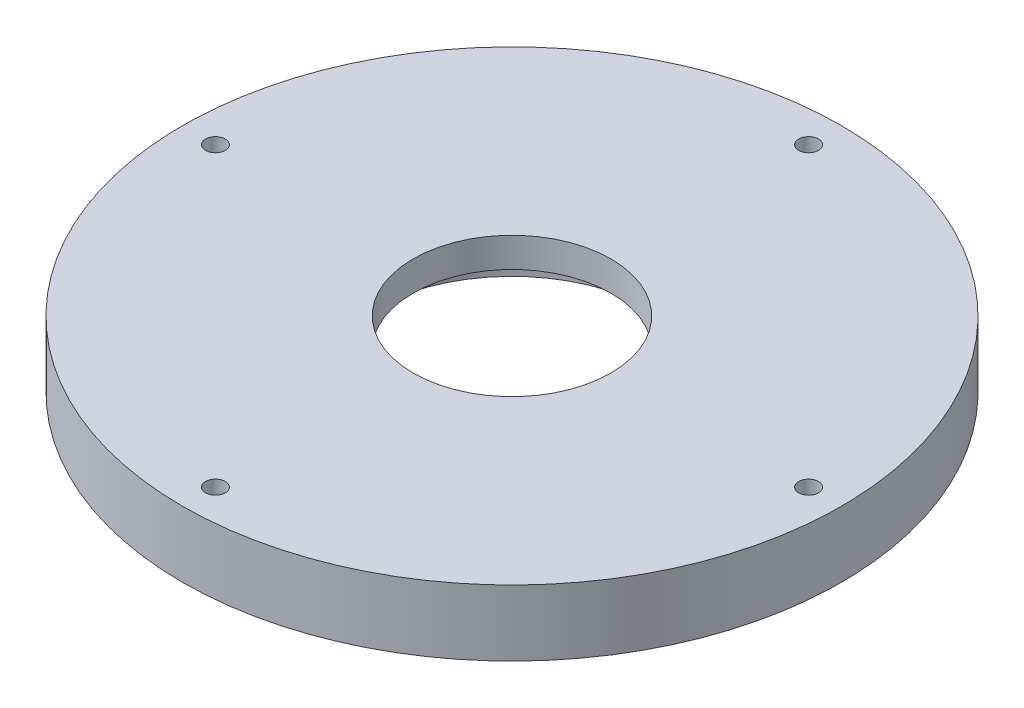
ISO-10303-21;
HEADER;
FILE_DESCRIPTION(('STEP AP214'),'2;1');
FILE_NAME('part.step','',(''),(''),'','','');
FILE_SCHEMA(('AUTOMOTIVE_DESIGN { 1 0 10303 214 1 1 1 1 }'));
ENDSEC;
DATA;
#1=APPLICATION_CONTEXT('core data for automotive mechanical design processes');
#2=APPLICATION_PROTOCOL_DEFINITION('international standard','automotive_design',2000,#1);
#3=PRODUCT_CONTEXT('',#1,'mechanical');
#4=PRODUCT('Part','Part','',(#3));
#5=PRODUCT_RELATED_PRODUCT_CATEGORY('part','',(#4));
#6=PRODUCT_DEFINITION_FORMATION('','',#4);
#7=PRODUCT_DEFINITION_CONTEXT('part definition',#1,'design');
#8=PRODUCT_DEFINITION('design','',#6,#7);
#9=PRODUCT_DEFINITION_SHAPE('','',#8);
#10=(LENGTH_UNIT() NAMED_UNIT(*) SI_UNIT(.MILLI.,.METRE.));
#11=(NAMED_UNIT(*) PLANE_ANGLE_UNIT() SI_UNIT($,.RADIAN.));
#12=(NAMED_UNIT(*) SI_UNIT($,.STERADIAN.) SOLID_ANGLE_UNIT());
#13=UNCERTAINTY_MEASURE_WITH_UNIT(LENGTH_MEASURE(1.E-05),#10,'distance_accuracy_value','');
#14=(GEOMETRIC_REPRESENTATION_CONTEXT(3) GLOBAL_UNCERTAINTY_ASSIGNED_CONTEXT((#13)) GLOBAL_UNIT_ASSIGNED_CONTEXT((#10,
#11,#12)) REPRESENTATION_CONTEXT('',''));
#15=CARTESIAN_POINT('',(0.,0.,0.));
#16=DIRECTION('',(0.,0.,1.));
#17=DIRECTION('',(1.,0.,0.));
#18=AXIS2_PLACEMENT_3D('',#15,#16,#17);
#19=CARTESIAN_POINT('',(0.,20.,0.));
#20=DIRECTION('',(0.,-1.,0.));
#21=DIRECTION('',(0.,0.,-1.));
#22=AXIS2_PLACEMENT_3D('',#19,#20,#21);
#23=CYLINDRICAL_SURFACE('',#22,30.);
#24=CARTESIAN_POINT('',(0.,20.,0.));
#25=DIRECTION('',(0.,1.,0.));
#26=DIRECTION('',(0.,0.,1.));
#27=AXIS2_PLACEMENT_3D('',#24,#25,#26);
#28=CIRCLE('',#27,30.);
#29=CARTESIAN_POINT('',(0.,20.,30.));
#30=VERTEX_POINT('',#29);
#31=EDGE_CURVE('E60',#30,#30,#28,.T.);
#32=ORIENTED_EDGE('',*,*,#31,.T.);
#33=EDGE_LOOP('',(#32));
#34=FACE_BOUND('',#33,.T.);
#35=CARTESIAN_POINT('',(0.,11.,0.));
#36=DIRECTION('',(0.,-1.,0.));
#37=DIRECTION('',(0.,0.,-1.));
#38=AXIS2_PLACEMENT_3D('',#35,#36,#37);
#39=CIRCLE('',#38,30.);
#40=CARTESIAN_POINT('',(0.,11.,-30.));
#41=VERTEX_POINT('',#40);
#42=EDGE_CURVE('E43',#41,#41,#39,.T.);
#43=ORIENTED_EDGE('',*,*,#42,.T.);
#44=EDGE_LOOP('',(#43));
#45=FACE_BOUND('',#44,.T.);
#46=ADVANCED_FACE('F39',(#34,#45),#23,.F.);
#47=CARTESIAN_POINT('',(0.,20.,0.));
#48=DIRECTION('',(0.,1.,0.));
#49=DIRECTION('',(0.,0.,1.));
#50=AXIS2_PLACEMENT_3D('',#47,#48,#49);
#51=PLANE('',#50);
#52=CARTESIAN_POINT('',(-6.28466640991764E-13,20.,90.));
#53=DIRECTION('',(0.,1.,0.));
#54=DIRECTION('',(0.,0.,1.));
#55=AXIS2_PLACEMENT_3D('',#52,#53,#54);
#56=CIRCLE('',#55,3.);
#57=CARTESIAN_POINT('',(-6.28466640991764E-13,20.,93.));
#58=VERTEX_POINT('',#57);
#59=EDGE_CURVE('E69',#58,#58,#56,.T.);
#60=ORIENTED_EDGE('',*,*,#59,.F.);
#61=EDGE_LOOP('',(#60));
#62=FACE_BOUND('',#61,.T.);
#63=ORIENTED_EDGE('',*,*,#31,.F.);
#64=EDGE_LOOP('',(#63));
#65=FACE_BOUND('',#64,.T.);
#66=CARTESIAN_POINT('',(0.,20.,0.));
#67=DIRECTION('',(0.,1.,0.));
#68=DIRECTION('',(0.,0.,1.));
#69=AXIS2_PLACEMENT_3D('',#66,#67,#68);
#70=CIRCLE('',#69,100.);
#71=CARTESIAN_POINT('',(0.,20.,100.));
#72=VERTEX_POINT('',#71);
#73=EDGE_CURVE('E10',#72,#72,#70,.T.);
#74=ORIENTED_EDGE('',*,*,#73,.T.);
#75=EDGE_LOOP('',(#74));
#76=FACE_BOUND('',#75,.T.);
#77=CARTESIAN_POINT('',(0.,20.,-90.));
#78=DIRECTION('',(0.,1.,0.));
#79=DIRECTION('',(0.,0.,1.));
#80=AXIS2_PLACEMENT_3D('',#77,#78,#79);
#81=CIRCLE('',#80,3.);
#82=CARTESIAN_POINT('',(0.,20.,-87.));
#83=VERTEX_POINT('',#82);
#84=EDGE_CURVE('E55',#83,#83,#81,.T.);
#85=ORIENTED_EDGE('',*,*,#84,.F.);
#86=EDGE_LOOP('',(#85));
#87=FACE_BOUND('',#86,.T.);
#88=CARTESIAN_POINT('',(90.,20.,3.14233320495882E-13));
#89=DIRECTION('',(0.,1.,0.));
#90=DIRECTION('',(0.,0.,1.));
#91=AXIS2_PLACEMENT_3D('',#88,#89,#90);
#92=CIRCLE('',#91,3.);
#93=CARTESIAN_POINT('',(90.,20.,3.00000000000031));
#94=VERTEX_POINT('',#93);
#95=EDGE_CURVE('E65',#94,#94,#92,.T.);
#96=ORIENTED_EDGE('',*,*,#95,.F.);
#97=EDGE_LOOP('',(#96));
#98=FACE_BOUND('',#97,.T.);
#99=CARTESIAN_POINT('',(-90.,20.,-9.42699961487646E-13));
#100=DIRECTION('',(0.,1.,0.));
#101=DIRECTION('',(0.,0.,1.));
#102=AXIS2_PLACEMENT_3D('',#99,#100,#101);
#103=CIRCLE('',#102,3.);
#104=CARTESIAN_POINT('',(-90.,20.,2.99999999999906));
#105=VERTEX_POINT('',#104);
#106=EDGE_CURVE('E74',#105,#105,#103,.T.);
#107=ORIENTED_EDGE('',*,*,#106,.F.);
#108=EDGE_LOOP('',(#107));
#109=FACE_BOUND('',#108,.T.);
#110=ADVANCED_FACE('F105',(#62,#65,#76,#87,#98,#109),#51,.T.);
#111=CARTESIAN_POINT('',(0.,0.,0.));
#112=DIRECTION('',(0.,1.,0.));
#113=DIRECTION('',(0.,0.,1.));
#114=AXIS2_PLACEMENT_3D('',#111,#112,#113);
#115=PLANE('',#114);
#116=CARTESIAN_POINT('',(0.,0.,0.));
#117=DIRECTION('',(0.,-1.,0.));
#118=DIRECTION('',(0.,0.,-1.));
#119=AXIS2_PLACEMENT_3D('',#116,#117,#118);
#120=CIRCLE('',#119,43.);
#121=CARTESIAN_POINT('',(0.,0.,-43.));
#122=VERTEX_POINT('',#121);
#123=EDGE_CURVE('E78',#122,#122,#120,.T.);
#124=ORIENTED_EDGE('',*,*,#123,.F.);
#125=EDGE_LOOP('',(#124));
#126=FACE_BOUND('',#125,.T.);
#127=CARTESIAN_POINT('',(0.,0.,0.));
#128=DIRECTION('',(0.,1.,0.));
#129=DIRECTION('',(0.,0.,1.));
#130=AXIS2_PLACEMENT_3D('',#127,#128,#129);
#131=CIRCLE('',#130,100.);
#132=CARTESIAN_POINT('',(0.,0.,100.));
#133=VERTEX_POINT('',#132);
#134=EDGE_CURVE('E50',#133,#133,#131,.T.);
#135=ORIENTED_EDGE('',*,*,#134,.F.);
#136=EDGE_LOOP('',(#135));
#137=FACE_BOUND('',#136,.T.);
#138=CARTESIAN_POINT('',(0.,0.,-90.));
#139=DIRECTION('',(0.,1.,0.));
#140=DIRECTION('',(0.,0.,1.));
#141=AXIS2_PLACEMENT_3D('',#138,#139,#140);
#142=CIRCLE('',#141,3.);
#143=CARTESIAN_POINT('',(0.,0.,-87.));
#144=VERTEX_POINT('',#143);
#145=EDGE_CURVE('E53',#144,#144,#142,.T.);
#146=ORIENTED_EDGE('',*,*,#145,.T.);
#147=EDGE_LOOP('',(#146));
#148=FACE_BOUND('',#147,.T.);
#149=CARTESIAN_POINT('',(90.,0.,3.14233320495882E-13));
#150=DIRECTION('',(0.,1.,0.));
#151=DIRECTION('',(0.,0.,1.));
#152=AXIS2_PLACEMENT_3D('',#149,#150,#151);
#153=CIRCLE('',#152,3.);
#154=CARTESIAN_POINT('',(90.,0.,3.00000000000031));
#155=VERTEX_POINT('',#154);
#156=EDGE_CURVE('E64',#155,#155,#153,.T.);
#157=ORIENTED_EDGE('',*,*,#156,.T.);
#158=EDGE_LOOP('',(#157));
#159=FACE_BOUND('',#158,.T.);
#160=CARTESIAN_POINT('',(-6.28466640991764E-13,0.,90.));
#161=DIRECTION('',(0.,1.,0.));
#162=DIRECTION('',(0.,0.,1.));
#163=AXIS2_PLACEMENT_3D('',#160,#161,#162);
#164=CIRCLE('',#163,3.);
#165=CARTESIAN_POINT('',(-6.28466640991764E-13,0.,93.));
#166=VERTEX_POINT('',#165);
#167=EDGE_CURVE('E68',#166,#166,#164,.T.);
#168=ORIENTED_EDGE('',*,*,#167,.T.);
#169=EDGE_LOOP('',(#168));
#170=FACE_BOUND('',#169,.T.);
#171=CARTESIAN_POINT('',(-90.,0.,-9.42699961487646E-13));
#172=DIRECTION('',(0.,1.,0.));
#173=DIRECTION('',(0.,0.,1.));
#174=AXIS2_PLACEMENT_3D('',#171,#172,#173);
#175=CIRCLE('',#174,3.);
#176=CARTESIAN_POINT('',(-90.,0.,2.99999999999906));
#177=VERTEX_POINT('',#176);
#178=EDGE_CURVE('E71',#177,#177,#175,.T.);
#179=ORIENTED_EDGE('',*,*,#178,.T.);
#180=EDGE_LOOP('',(#179));
#181=FACE_BOUND('',#180,.T.);
#182=ADVANCED_FACE('F109',(#126,#137,#148,#159,#170,#181),#115,.F.);
#183=CARTESIAN_POINT('',(0.,20.,0.));
#184=DIRECTION('',(0.,-1.,0.));
#185=DIRECTION('',(0.,0.,-1.));
#186=AXIS2_PLACEMENT_3D('',#183,#184,#185);
#187=CYLINDRICAL_SURFACE('',#186,100.);
#188=ORIENTED_EDGE('',*,*,#73,.F.);
#189=EDGE_LOOP('',(#188));
#190=FACE_BOUND('',#189,.T.);
#191=ORIENTED_EDGE('',*,*,#134,.T.);
#192=EDGE_LOOP('',(#191));
#193=FACE_BOUND('',#192,.T.);
#194=ADVANCED_FACE('F41',(#190,#193),#187,.T.);
#195=CARTESIAN_POINT('',(0.,20.,-90.));
#196=DIRECTION('',(0.,-1.,0.));
#197=DIRECTION('',(0.,0.,-1.));
#198=AXIS2_PLACEMENT_3D('',#195,#196,#197);
#199=CYLINDRICAL_SURFACE('',#198,3.);
#200=ORIENTED_EDGE('',*,*,#84,.T.);
#201=EDGE_LOOP('',(#200));
#202=FACE_BOUND('',#201,.T.);
#203=ORIENTED_EDGE('',*,*,#145,.F.);
#204=EDGE_LOOP('',(#203));
#205=FACE_BOUND('',#204,.T.);
#206=ADVANCED_FACE('F120',(#202,#205),#199,.F.);
#207=CARTESIAN_POINT('',(90.,20.,3.14233320495882E-13));
#208=DIRECTION('',(0.,-1.,0.));
#209=DIRECTION('',(0.,0.,-1.));
#210=AXIS2_PLACEMENT_3D('',#207,#208,#209);
#211=CYLINDRICAL_SURFACE('',#210,3.);
#212=ORIENTED_EDGE('',*,*,#95,.T.);
#213=EDGE_LOOP('',(#212));
#214=FACE_BOUND('',#213,.T.);
#215=ORIENTED_EDGE('',*,*,#156,.F.);
#216=EDGE_LOOP('',(#215));
#217=FACE_BOUND('',#216,.T.);
#218=ADVANCED_FACE('F114',(#214,#217),#211,.F.);
#219=CARTESIAN_POINT('',(-6.28466640991764E-13,20.,90.));
#220=DIRECTION('',(0.,-1.,0.));
#221=DIRECTION('',(0.,0.,-1.));
#222=AXIS2_PLACEMENT_3D('',#219,#220,#221);
#223=CYLINDRICAL_SURFACE('',#222,3.);
#224=ORIENTED_EDGE('',*,*,#59,.T.);
#225=EDGE_LOOP('',(#224));
#226=FACE_BOUND('',#225,.T.);
#227=ORIENTED_EDGE('',*,*,#167,.F.);
#228=EDGE_LOOP('',(#227));
#229=FACE_BOUND('',#228,.T.);
#230=ADVANCED_FACE('F139',(#226,#229),#223,.F.);
#231=CARTESIAN_POINT('',(-90.,20.,-9.42699961487646E-13));
#232=DIRECTION('',(0.,-1.,0.));
#233=DIRECTION('',(0.,0.,-1.));
#234=AXIS2_PLACEMENT_3D('',#231,#232,#233);
#235=CYLINDRICAL_SURFACE('',#234,3.);
#236=ORIENTED_EDGE('',*,*,#106,.T.);
#237=EDGE_LOOP('',(#236));
#238=FACE_BOUND('',#237,.T.);
#239=ORIENTED_EDGE('',*,*,#178,.F.);
#240=EDGE_LOOP('',(#239));
#241=FACE_BOUND('',#240,.T.);
#242=ADVANCED_FACE('F96',(#238,#241),#235,.F.);
#243=CARTESIAN_POINT('',(0.,11.,0.));
#244=DIRECTION('',(0.,-1.,0.));
#245=DIRECTION('',(0.,0.,-1.));
#246=AXIS2_PLACEMENT_3D('',#243,#244,#245);
#247=CYLINDRICAL_SURFACE('',#246,43.);
#248=CARTESIAN_POINT('',(0.,11.,0.));
#249=DIRECTION('',(0.,-1.,0.));
#250=DIRECTION('',(0.,0.,-1.));
#251=AXIS2_PLACEMENT_3D('',#248,#249,#250);
#252=CIRCLE('',#251,43.);
#253=CARTESIAN_POINT('',(0.,11.,-43.));
#254=VERTEX_POINT('',#253);
#255=EDGE_CURVE('E84',#254,#254,#252,.T.);
#256=ORIENTED_EDGE('',*,*,#255,.F.);
#257=EDGE_LOOP('',(#256));
#258=FACE_BOUND('',#257,.T.);
#259=ORIENTED_EDGE('',*,*,#123,.T.);
#260=EDGE_LOOP('',(#259));
#261=FACE_BOUND('',#260,.T.);
#262=ADVANCED_FACE('F92',(#258,#261),#247,.F.);
#263=CARTESIAN_POINT('',(0.,11.,0.));
#264=DIRECTION('',(0.,-1.,0.));
#265=DIRECTION('',(0.,0.,-1.));
#266=AXIS2_PLACEMENT_3D('',#263,#264,#265);
#267=PLANE('',#266);
#268=ORIENTED_EDGE('',*,*,#42,.F.);
#269=EDGE_LOOP('',(#268));
#270=FACE_BOUND('',#269,.T.);
#271=ORIENTED_EDGE('',*,*,#255,.T.);
#272=EDGE_LOOP('',(#271));
#273=FACE_BOUND('',#272,.T.);
#274=ADVANCED_FACE('F93',(#270,#273),#267,.T.);
#275=CLOSED_SHELL('',(#46,#110,#182,#194,#206,#218,#230,#242,#262,#274));
#276=MANIFOLD_SOLID_BREP('B2',#275);
#277=ADVANCED_BREP_SHAPE_REPRESENTATION('',(#18,#276),#14);
#278=SHAPE_DEFINITION_REPRESENTATION(#9,#277);
ENDSEC;
END-ISO-10303-21;
